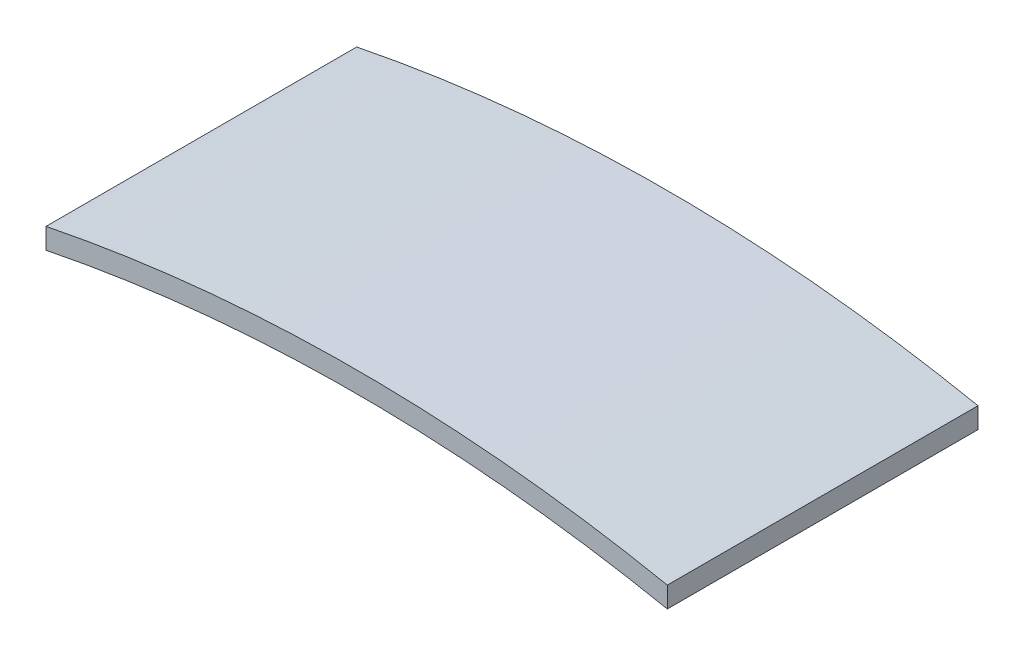
ISO-10303-21;
HEADER;
FILE_DESCRIPTION(('STEP AP214'),'2;1');
FILE_NAME('part.step','',(''),(''),'','','');
FILE_SCHEMA(('AUTOMOTIVE_DESIGN { 1 0 10303 214 1 1 1 1 }'));
ENDSEC;
DATA;
#1=APPLICATION_CONTEXT('core data for automotive mechanical design processes');
#2=APPLICATION_PROTOCOL_DEFINITION('international standard','automotive_design',2000,#1);
#3=PRODUCT_CONTEXT('',#1,'mechanical');
#4=PRODUCT('Part','Part','',(#3));
#5=PRODUCT_RELATED_PRODUCT_CATEGORY('part','',(#4));
#6=PRODUCT_DEFINITION_FORMATION('','',#4);
#7=PRODUCT_DEFINITION_CONTEXT('part definition',#1,'design');
#8=PRODUCT_DEFINITION('design','',#6,#7);
#9=PRODUCT_DEFINITION_SHAPE('','',#8);
#10=(LENGTH_UNIT() NAMED_UNIT(*) SI_UNIT(.MILLI.,.METRE.));
#11=(NAMED_UNIT(*) PLANE_ANGLE_UNIT() SI_UNIT($,.RADIAN.));
#12=(NAMED_UNIT(*) SI_UNIT($,.STERADIAN.) SOLID_ANGLE_UNIT());
#13=UNCERTAINTY_MEASURE_WITH_UNIT(LENGTH_MEASURE(1.E-05),#10,'distance_accuracy_value','');
#14=(GEOMETRIC_REPRESENTATION_CONTEXT(3) GLOBAL_UNCERTAINTY_ASSIGNED_CONTEXT((#13)) GLOBAL_UNIT_ASSIGNED_CONTEXT((#10,
#11,#12)) REPRESENTATION_CONTEXT('',''));
#15=CARTESIAN_POINT('',(0.,0.,0.));
#16=DIRECTION('',(0.,0.,1.));
#17=DIRECTION('',(1.,0.,0.));
#18=AXIS2_PLACEMENT_3D('',#15,#16,#17);
#19=CARTESIAN_POINT('',(7.49400541621981E-13,-627.500000000008,150.));
#20=DIRECTION('',(0.,0.,-1.));
#21=DIRECTION('',(-1.,0.,0.));
#22=AXIS2_PLACEMENT_3D('',#19,#20,#21);
#23=CYLINDRICAL_SURFACE('',#22,757.500000000007);
#24=CARTESIAN_POINT('',(7.49400541621981E-13,-627.500000000008,0.));
#25=DIRECTION('',(0.,0.,-1.));
#26=DIRECTION('',(-1.,0.,0.));
#27=AXIS2_PLACEMENT_3D('',#24,#25,#26);
#28=CIRCLE('',#27,757.500000000007);
#29=CARTESIAN_POINT('',(-150.,115.,0.));
#30=VERTEX_POINT('',#29);
#31=CARTESIAN_POINT('',(150.,115.,0.));
#32=VERTEX_POINT('',#31);
#33=EDGE_CURVE('E102',#30,#32,#28,.T.);
#34=ORIENTED_EDGE('',*,*,#33,.T.);
#35=DIRECTION('',(0.,0.,-1.));
#36=VECTOR('',#35,1.);
#37=CARTESIAN_POINT('',(150.,115.,150.));
#38=LINE('',#37,#36);
#39=CARTESIAN_POINT('',(150.,115.,150.));
#40=VERTEX_POINT('',#39);
#41=EDGE_CURVE('E11',#40,#32,#38,.T.);
#42=ORIENTED_EDGE('',*,*,#41,.F.);
#43=CARTESIAN_POINT('',(7.49400541621981E-13,-627.500000000008,150.));
#44=DIRECTION('',(0.,0.,-1.));
#45=DIRECTION('',(-1.,0.,0.));
#46=AXIS2_PLACEMENT_3D('',#43,#44,#45);
#47=CIRCLE('',#46,757.500000000007);
#48=CARTESIAN_POINT('',(-150.,115.,150.));
#49=VERTEX_POINT('',#48);
#50=EDGE_CURVE('E95',#49,#40,#47,.T.);
#51=ORIENTED_EDGE('',*,*,#50,.F.);
#52=DIRECTION('',(0.,0.,-1.));
#53=VECTOR('',#52,1.);
#54=CARTESIAN_POINT('',(-150.,115.,150.));
#55=LINE('',#54,#53);
#56=EDGE_CURVE('E99',#49,#30,#55,.T.);
#57=ORIENTED_EDGE('',*,*,#56,.T.);
#58=EDGE_LOOP('',(#34,#42,#51,#57));
#59=FACE_BOUND('',#58,.T.);
#60=ADVANCED_FACE('F41',(#59),#23,.F.);
#61=CARTESIAN_POINT('',(150.,115.,150.));
#62=DIRECTION('',(-1.,0.,0.));
#63=DIRECTION('',(0.,0.,1.));
#64=AXIS2_PLACEMENT_3D('',#61,#62,#63);
#65=PLANE('',#64);
#66=DIRECTION('',(0.,1.,0.));
#67=VECTOR('',#66,1.);
#68=CARTESIAN_POINT('',(150.,115.,0.));
#69=LINE('',#68,#67);
#70=CARTESIAN_POINT('',(150.,125.,0.));
#71=VERTEX_POINT('',#70);
#72=EDGE_CURVE('E96',#32,#71,#69,.T.);
#73=ORIENTED_EDGE('',*,*,#72,.T.);
#74=DIRECTION('',(0.,0.,-1.));
#75=VECTOR('',#74,1.);
#76=CARTESIAN_POINT('',(150.,125.,150.));
#77=LINE('',#76,#75);
#78=CARTESIAN_POINT('',(150.,125.,150.));
#79=VERTEX_POINT('',#78);
#80=EDGE_CURVE('E47',#79,#71,#77,.T.);
#81=ORIENTED_EDGE('',*,*,#80,.F.);
#82=DIRECTION('',(0.,1.,0.));
#83=VECTOR('',#82,1.);
#84=CARTESIAN_POINT('',(150.,115.,150.));
#85=LINE('',#84,#83);
#86=EDGE_CURVE('E87',#40,#79,#85,.T.);
#87=ORIENTED_EDGE('',*,*,#86,.F.);
#88=ORIENTED_EDGE('',*,*,#41,.T.);
#89=EDGE_LOOP('',(#73,#81,#87,#88));
#90=FACE_BOUND('',#89,.T.);
#91=ADVANCED_FACE('F92',(#90),#65,.F.);
#92=CARTESIAN_POINT('',(-8.74300631892311E-13,-617.500000000008,150.));
#93=DIRECTION('',(0.,0.,-1.));
#94=DIRECTION('',(-1.,0.,0.));
#95=AXIS2_PLACEMENT_3D('',#92,#93,#94);
#96=CYLINDRICAL_SURFACE('',#95,757.500000000008);
#97=CARTESIAN_POINT('',(-8.74300631892311E-13,-617.500000000008,0.));
#98=DIRECTION('',(0.,0.,1.));
#99=DIRECTION('',(1.,0.,0.));
#100=AXIS2_PLACEMENT_3D('',#97,#98,#99);
#101=CIRCLE('',#100,757.500000000008);
#102=CARTESIAN_POINT('',(-150.,125.,0.));
#103=VERTEX_POINT('',#102);
#104=EDGE_CURVE('E74',#71,#103,#101,.T.);
#105=ORIENTED_EDGE('',*,*,#104,.T.);
#106=DIRECTION('',(0.,0.,-1.));
#107=VECTOR('',#106,1.);
#108=CARTESIAN_POINT('',(-150.,125.,150.));
#109=LINE('',#108,#107);
#110=CARTESIAN_POINT('',(-150.,125.,150.));
#111=VERTEX_POINT('',#110);
#112=EDGE_CURVE('E100',#111,#103,#109,.T.);
#113=ORIENTED_EDGE('',*,*,#112,.F.);
#114=CARTESIAN_POINT('',(-8.74300631892311E-13,-617.500000000008,150.));
#115=DIRECTION('',(0.,0.,1.));
#116=DIRECTION('',(1.,0.,0.));
#117=AXIS2_PLACEMENT_3D('',#114,#115,#116);
#118=CIRCLE('',#117,757.500000000008);
#119=EDGE_CURVE('E89',#79,#111,#118,.T.);
#120=ORIENTED_EDGE('',*,*,#119,.F.);
#121=ORIENTED_EDGE('',*,*,#80,.T.);
#122=EDGE_LOOP('',(#105,#113,#120,#121));
#123=FACE_BOUND('',#122,.T.);
#124=ADVANCED_FACE('F98',(#123),#96,.T.);
#125=CARTESIAN_POINT('',(-150.,125.,150.));
#126=DIRECTION('',(1.,0.,0.));
#127=DIRECTION('',(0.,0.,-1.));
#128=AXIS2_PLACEMENT_3D('',#125,#126,#127);
#129=PLANE('',#128);
#130=DIRECTION('',(0.,-1.,0.));
#131=VECTOR('',#130,1.);
#132=CARTESIAN_POINT('',(-150.,125.,0.));
#133=LINE('',#132,#131);
#134=EDGE_CURVE('E79',#103,#30,#133,.T.);
#135=ORIENTED_EDGE('',*,*,#134,.T.);
#136=ORIENTED_EDGE('',*,*,#56,.F.);
#137=DIRECTION('',(0.,-1.,0.));
#138=VECTOR('',#137,1.);
#139=CARTESIAN_POINT('',(-150.,125.,150.));
#140=LINE('',#139,#138);
#141=EDGE_CURVE('E60',#111,#49,#140,.T.);
#142=ORIENTED_EDGE('',*,*,#141,.F.);
#143=ORIENTED_EDGE('',*,*,#112,.T.);
#144=EDGE_LOOP('',(#135,#136,#142,#143));
#145=FACE_BOUND('',#144,.T.);
#146=ADVANCED_FACE('F112',(#145),#129,.F.);
#147=CARTESIAN_POINT('',(7.49400541621981E-13,-627.500000000008,150.));
#148=DIRECTION('',(0.,0.,-1.));
#149=DIRECTION('',(-1.,0.,0.));
#150=AXIS2_PLACEMENT_3D('',#147,#148,#149);
#151=PLANE('',#150);
#152=ORIENTED_EDGE('',*,*,#50,.T.);
#153=ORIENTED_EDGE('',*,*,#86,.T.);
#154=ORIENTED_EDGE('',*,*,#119,.T.);
#155=ORIENTED_EDGE('',*,*,#141,.T.);
#156=EDGE_LOOP('',(#152,#153,#154,#155));
#157=FACE_BOUND('',#156,.T.);
#158=ADVANCED_FACE('F86',(#157),#151,.F.);
#159=CARTESIAN_POINT('',(7.49400541621981E-13,-627.500000000008,0.));
#160=DIRECTION('',(0.,0.,-1.));
#161=DIRECTION('',(-1.,0.,0.));
#162=AXIS2_PLACEMENT_3D('',#159,#160,#161);
#163=PLANE('',#162);
#164=ORIENTED_EDGE('',*,*,#33,.F.);
#165=ORIENTED_EDGE('',*,*,#134,.F.);
#166=ORIENTED_EDGE('',*,*,#104,.F.);
#167=ORIENTED_EDGE('',*,*,#72,.F.);
#168=EDGE_LOOP('',(#164,#165,#166,#167));
#169=FACE_BOUND('',#168,.T.);
#170=ADVANCED_FACE('F111',(#169),#163,.T.);
#171=CLOSED_SHELL('',(#60,#91,#124,#146,#158,#170));
#172=MANIFOLD_SOLID_BREP('B2',#171);
#173=ADVANCED_BREP_SHAPE_REPRESENTATION('',(#18,#172),#14);
#174=SHAPE_DEFINITION_REPRESENTATION(#9,#173);
ENDSEC;
END-ISO-10303-21;
